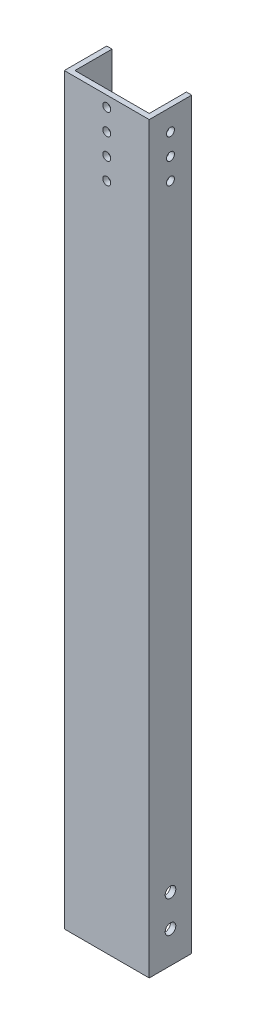
ISO-10303-21;
HEADER;
FILE_DESCRIPTION(('STEP AP214'),'2;1');
FILE_NAME('part.step','',(''),(''),'','','');
FILE_SCHEMA(('AUTOMOTIVE_DESIGN { 1 0 10303 214 1 1 1 1 }'));
ENDSEC;
DATA;
#1=APPLICATION_CONTEXT('core data for automotive mechanical design processes');
#2=APPLICATION_PROTOCOL_DEFINITION('international standard','automotive_design',2000,#1);
#3=PRODUCT_CONTEXT('',#1,'mechanical');
#4=PRODUCT('Part','Part','',(#3));
#5=PRODUCT_RELATED_PRODUCT_CATEGORY('part','',(#4));
#6=PRODUCT_DEFINITION_FORMATION('','',#4);
#7=PRODUCT_DEFINITION_CONTEXT('part definition',#1,'design');
#8=PRODUCT_DEFINITION('design','',#6,#7);
#9=PRODUCT_DEFINITION_SHAPE('','',#8);
#10=(LENGTH_UNIT() NAMED_UNIT(*) SI_UNIT(.MILLI.,.METRE.));
#11=(NAMED_UNIT(*) PLANE_ANGLE_UNIT() SI_UNIT($,.RADIAN.));
#12=(NAMED_UNIT(*) SI_UNIT($,.STERADIAN.) SOLID_ANGLE_UNIT());
#13=UNCERTAINTY_MEASURE_WITH_UNIT(LENGTH_MEASURE(1.E-05),#10,'distance_accuracy_value','');
#14=(GEOMETRIC_REPRESENTATION_CONTEXT(3) GLOBAL_UNCERTAINTY_ASSIGNED_CONTEXT((#13)) GLOBAL_UNIT_ASSIGNED_CONTEXT((#10,
#11,#12)) REPRESENTATION_CONTEXT('',''));
#15=CARTESIAN_POINT('',(0.,0.,0.));
#16=DIRECTION('',(0.,0.,1.));
#17=DIRECTION('',(1.,0.,0.));
#18=AXIS2_PLACEMENT_3D('',#15,#16,#17);
#19=CARTESIAN_POINT('',(0.,431.8,-12.7));
#20=DIRECTION('',(1.,0.,0.));
#21=DIRECTION('',(0.,0.,-1.));
#22=AXIS2_PLACEMENT_3D('',#19,#20,#21);
#23=CYLINDRICAL_SURFACE('',#22,2.38125000000006);
#24=CARTESIAN_POINT('',(0.,431.8,-12.7));
#25=DIRECTION('',(1.,0.,0.));
#26=DIRECTION('',(0.,0.,-1.));
#27=AXIS2_PLACEMENT_3D('',#24,#25,#26);
#28=CIRCLE('',#27,2.38125000000006);
#29=CARTESIAN_POINT('',(0.,431.8,-15.0812500000001));
#30=VERTEX_POINT('',#29);
#31=EDGE_CURVE('E167',#30,#30,#28,.F.);
#32=ORIENTED_EDGE('',*,*,#31,.T.);
#33=EDGE_LOOP('',(#32));
#34=FACE_BOUND('',#33,.T.);
#35=CARTESIAN_POINT('',(3.175,431.8,-12.7));
#36=DIRECTION('',(1.,0.,0.));
#37=DIRECTION('',(0.,0.,-1.));
#38=AXIS2_PLACEMENT_3D('',#35,#36,#37);
#39=CIRCLE('',#38,2.38125000000006);
#40=CARTESIAN_POINT('',(3.175,431.8,-15.0812500000001));
#41=VERTEX_POINT('',#40);
#42=EDGE_CURVE('E124',#41,#41,#39,.T.);
#43=ORIENTED_EDGE('',*,*,#42,.T.);
#44=EDGE_LOOP('',(#43));
#45=FACE_BOUND('',#44,.T.);
#46=ADVANCED_FACE('F17',(#34,#45),#23,.F.);
#47=CARTESIAN_POINT('',(0.,406.4,-12.7));
#48=DIRECTION('',(1.,0.,0.));
#49=DIRECTION('',(0.,0.,-1.));
#50=AXIS2_PLACEMENT_3D('',#47,#48,#49);
#51=CYLINDRICAL_SURFACE('',#50,2.38125000000006);
#52=CARTESIAN_POINT('',(0.,406.4,-12.7));
#53=DIRECTION('',(1.,0.,0.));
#54=DIRECTION('',(0.,0.,-1.));
#55=AXIS2_PLACEMENT_3D('',#52,#53,#54);
#56=CIRCLE('',#55,2.38125000000006);
#57=CARTESIAN_POINT('',(0.,406.4,-15.0812500000001));
#58=VERTEX_POINT('',#57);
#59=EDGE_CURVE('E164',#58,#58,#56,.F.);
#60=ORIENTED_EDGE('',*,*,#59,.T.);
#61=EDGE_LOOP('',(#60));
#62=FACE_BOUND('',#61,.T.);
#63=CARTESIAN_POINT('',(3.175,406.4,-12.7));
#64=DIRECTION('',(1.,0.,0.));
#65=DIRECTION('',(0.,0.,-1.));
#66=AXIS2_PLACEMENT_3D('',#63,#64,#65);
#67=CIRCLE('',#66,2.38125000000006);
#68=CARTESIAN_POINT('',(3.175,406.4,-15.0812500000001));
#69=VERTEX_POINT('',#68);
#70=EDGE_CURVE('E189',#69,#69,#67,.T.);
#71=ORIENTED_EDGE('',*,*,#70,.T.);
#72=EDGE_LOOP('',(#71));
#73=FACE_BOUND('',#72,.T.);
#74=ADVANCED_FACE('F284',(#62,#73),#51,.F.);
#75=CARTESIAN_POINT('',(0.,419.1,-12.7));
#76=DIRECTION('',(1.,0.,0.));
#77=DIRECTION('',(0.,0.,-1.));
#78=AXIS2_PLACEMENT_3D('',#75,#76,#77);
#79=CYLINDRICAL_SURFACE('',#78,2.38125000000006);
#80=CARTESIAN_POINT('',(0.,419.1,-12.7));
#81=DIRECTION('',(1.,0.,0.));
#82=DIRECTION('',(0.,0.,-1.));
#83=AXIS2_PLACEMENT_3D('',#80,#81,#82);
#84=CIRCLE('',#83,2.38125000000006);
#85=CARTESIAN_POINT('',(0.,419.1,-15.0812500000001));
#86=VERTEX_POINT('',#85);
#87=EDGE_CURVE('E161',#86,#86,#84,.F.);
#88=ORIENTED_EDGE('',*,*,#87,.T.);
#89=EDGE_LOOP('',(#88));
#90=FACE_BOUND('',#89,.T.);
#91=CARTESIAN_POINT('',(3.175,419.1,-12.7));
#92=DIRECTION('',(1.,0.,0.));
#93=DIRECTION('',(0.,0.,-1.));
#94=AXIS2_PLACEMENT_3D('',#91,#92,#93);
#95=CIRCLE('',#94,2.38125000000006);
#96=CARTESIAN_POINT('',(3.175,419.1,-15.0812500000001));
#97=VERTEX_POINT('',#96);
#98=EDGE_CURVE('E186',#97,#97,#95,.T.);
#99=ORIENTED_EDGE('',*,*,#98,.T.);
#100=EDGE_LOOP('',(#99));
#101=FACE_BOUND('',#100,.T.);
#102=ADVANCED_FACE('F289',(#90,#101),#79,.F.);
#103=CARTESIAN_POINT('',(0.,19.05,-12.7));
#104=DIRECTION('',(1.,0.,0.));
#105=DIRECTION('',(0.,0.,-1.));
#106=AXIS2_PLACEMENT_3D('',#103,#104,#105);
#107=CYLINDRICAL_SURFACE('',#106,3.17500000000001);
#108=CARTESIAN_POINT('',(0.,19.05,-12.7));
#109=DIRECTION('',(1.,0.,0.));
#110=DIRECTION('',(0.,0.,-1.));
#111=AXIS2_PLACEMENT_3D('',#108,#109,#110);
#112=CIRCLE('',#111,3.17500000000001);
#113=CARTESIAN_POINT('',(0.,19.05,-15.875));
#114=VERTEX_POINT('',#113);
#115=EDGE_CURVE('E158',#114,#114,#112,.F.);
#116=ORIENTED_EDGE('',*,*,#115,.T.);
#117=EDGE_LOOP('',(#116));
#118=FACE_BOUND('',#117,.T.);
#119=CARTESIAN_POINT('',(3.175,19.05,-12.7));
#120=DIRECTION('',(1.,0.,0.));
#121=DIRECTION('',(0.,0.,-1.));
#122=AXIS2_PLACEMENT_3D('',#119,#120,#121);
#123=CIRCLE('',#122,3.17500000000001);
#124=CARTESIAN_POINT('',(3.175,19.05,-15.875));
#125=VERTEX_POINT('',#124);
#126=EDGE_CURVE('E183',#125,#125,#123,.T.);
#127=ORIENTED_EDGE('',*,*,#126,.T.);
#128=EDGE_LOOP('',(#127));
#129=FACE_BOUND('',#128,.T.);
#130=ADVANCED_FACE('F296',(#118,#129),#107,.F.);
#131=CARTESIAN_POINT('',(0.,38.1,-12.7));
#132=DIRECTION('',(1.,0.,0.));
#133=DIRECTION('',(0.,0.,-1.));
#134=AXIS2_PLACEMENT_3D('',#131,#132,#133);
#135=CYLINDRICAL_SURFACE('',#134,3.175);
#136=CARTESIAN_POINT('',(0.,38.1,-12.7));
#137=DIRECTION('',(1.,0.,0.));
#138=DIRECTION('',(0.,0.,-1.));
#139=AXIS2_PLACEMENT_3D('',#136,#137,#138);
#140=CIRCLE('',#139,3.175);
#141=CARTESIAN_POINT('',(0.,38.1,-15.875));
#142=VERTEX_POINT('',#141);
#143=EDGE_CURVE('E95',#142,#142,#140,.F.);
#144=ORIENTED_EDGE('',*,*,#143,.T.);
#145=EDGE_LOOP('',(#144));
#146=FACE_BOUND('',#145,.T.);
#147=CARTESIAN_POINT('',(3.175,38.1,-12.7));
#148=DIRECTION('',(1.,0.,0.));
#149=DIRECTION('',(0.,0.,-1.));
#150=AXIS2_PLACEMENT_3D('',#147,#148,#149);
#151=CIRCLE('',#150,3.175);
#152=CARTESIAN_POINT('',(3.175,38.1,-15.875));
#153=VERTEX_POINT('',#152);
#154=EDGE_CURVE('E120',#153,#153,#151,.T.);
#155=ORIENTED_EDGE('',*,*,#154,.T.);
#156=EDGE_LOOP('',(#155));
#157=FACE_BOUND('',#156,.T.);
#158=ADVANCED_FACE('F303',(#146,#157),#135,.F.);
#159=CARTESIAN_POINT('',(0.,431.8,-12.7));
#160=DIRECTION('',(1.,0.,0.));
#161=DIRECTION('',(0.,0.,-1.));
#162=AXIS2_PLACEMENT_3D('',#159,#160,#161);
#163=CYLINDRICAL_SURFACE('',#162,2.38125000000006);
#164=CARTESIAN_POINT('',(47.625,431.8,-12.7));
#165=DIRECTION('',(1.,0.,0.));
#166=DIRECTION('',(0.,0.,-1.));
#167=AXIS2_PLACEMENT_3D('',#164,#165,#166);
#168=CIRCLE('',#167,2.38125000000006);
#169=CARTESIAN_POINT('',(47.625,431.8,-15.0812500000001));
#170=VERTEX_POINT('',#169);
#171=EDGE_CURVE('E20',#170,#170,#168,.F.);
#172=ORIENTED_EDGE('',*,*,#171,.T.);
#173=EDGE_LOOP('',(#172));
#174=FACE_BOUND('',#173,.T.);
#175=CARTESIAN_POINT('',(50.8,431.8,-12.7));
#176=DIRECTION('',(1.,0.,0.));
#177=DIRECTION('',(0.,0.,-1.));
#178=AXIS2_PLACEMENT_3D('',#175,#176,#177);
#179=CIRCLE('',#178,2.38125000000006);
#180=CARTESIAN_POINT('',(50.8,431.8,-15.0812500000001));
#181=VERTEX_POINT('',#180);
#182=EDGE_CURVE('E103',#181,#181,#179,.T.);
#183=ORIENTED_EDGE('',*,*,#182,.T.);
#184=EDGE_LOOP('',(#183));
#185=FACE_BOUND('',#184,.T.);
#186=ADVANCED_FACE('F208',(#174,#185),#163,.F.);
#187=CARTESIAN_POINT('',(0.,406.4,-12.7));
#188=DIRECTION('',(1.,0.,0.));
#189=DIRECTION('',(0.,0.,-1.));
#190=AXIS2_PLACEMENT_3D('',#187,#188,#189);
#191=CYLINDRICAL_SURFACE('',#190,2.38125000000006);
#192=CARTESIAN_POINT('',(47.625,406.4,-12.7));
#193=DIRECTION('',(1.,0.,0.));
#194=DIRECTION('',(0.,0.,-1.));
#195=AXIS2_PLACEMENT_3D('',#192,#193,#194);
#196=CIRCLE('',#195,2.38125000000006);
#197=CARTESIAN_POINT('',(47.625,406.4,-15.0812500000001));
#198=VERTEX_POINT('',#197);
#199=EDGE_CURVE('E201',#198,#198,#196,.F.);
#200=ORIENTED_EDGE('',*,*,#199,.T.);
#201=EDGE_LOOP('',(#200));
#202=FACE_BOUND('',#201,.T.);
#203=CARTESIAN_POINT('',(50.8,406.4,-12.7));
#204=DIRECTION('',(1.,0.,0.));
#205=DIRECTION('',(0.,0.,-1.));
#206=AXIS2_PLACEMENT_3D('',#203,#204,#205);
#207=CIRCLE('',#206,2.38125000000006);
#208=CARTESIAN_POINT('',(50.8,406.4,-15.0812500000001));
#209=VERTEX_POINT('',#208);
#210=EDGE_CURVE('E151',#209,#209,#207,.T.);
#211=ORIENTED_EDGE('',*,*,#210,.T.);
#212=EDGE_LOOP('',(#211));
#213=FACE_BOUND('',#212,.T.);
#214=ADVANCED_FACE('F310',(#202,#213),#191,.F.);
#215=CARTESIAN_POINT('',(0.,419.1,-12.7));
#216=DIRECTION('',(1.,0.,0.));
#217=DIRECTION('',(0.,0.,-1.));
#218=AXIS2_PLACEMENT_3D('',#215,#216,#217);
#219=CYLINDRICAL_SURFACE('',#218,2.38125000000006);
#220=CARTESIAN_POINT('',(47.625,419.1,-12.7));
#221=DIRECTION('',(1.,0.,0.));
#222=DIRECTION('',(0.,0.,-1.));
#223=AXIS2_PLACEMENT_3D('',#220,#221,#222);
#224=CIRCLE('',#223,2.38125000000006);
#225=CARTESIAN_POINT('',(47.625,419.1,-15.0812500000001));
#226=VERTEX_POINT('',#225);
#227=EDGE_CURVE('E199',#226,#226,#224,.F.);
#228=ORIENTED_EDGE('',*,*,#227,.T.);
#229=EDGE_LOOP('',(#228));
#230=FACE_BOUND('',#229,.T.);
#231=CARTESIAN_POINT('',(50.8,419.1,-12.7));
#232=DIRECTION('',(1.,0.,0.));
#233=DIRECTION('',(0.,0.,-1.));
#234=AXIS2_PLACEMENT_3D('',#231,#232,#233);
#235=CIRCLE('',#234,2.38125000000006);
#236=CARTESIAN_POINT('',(50.8,419.1,-15.0812500000001));
#237=VERTEX_POINT('',#236);
#238=EDGE_CURVE('E148',#237,#237,#235,.T.);
#239=ORIENTED_EDGE('',*,*,#238,.T.);
#240=EDGE_LOOP('',(#239));
#241=FACE_BOUND('',#240,.T.);
#242=ADVANCED_FACE('F313',(#230,#241),#219,.F.);
#243=CARTESIAN_POINT('',(0.,19.05,-12.7));
#244=DIRECTION('',(1.,0.,0.));
#245=DIRECTION('',(0.,0.,-1.));
#246=AXIS2_PLACEMENT_3D('',#243,#244,#245);
#247=CYLINDRICAL_SURFACE('',#246,3.17500000000001);
#248=CARTESIAN_POINT('',(47.625,19.05,-12.7));
#249=DIRECTION('',(1.,0.,0.));
#250=DIRECTION('',(0.,0.,-1.));
#251=AXIS2_PLACEMENT_3D('',#248,#249,#250);
#252=CIRCLE('',#251,3.17500000000001);
#253=CARTESIAN_POINT('',(47.625,19.05,-15.875));
#254=VERTEX_POINT('',#253);
#255=EDGE_CURVE('E196',#254,#254,#252,.F.);
#256=ORIENTED_EDGE('',*,*,#255,.T.);
#257=EDGE_LOOP('',(#256));
#258=FACE_BOUND('',#257,.T.);
#259=CARTESIAN_POINT('',(50.8,19.05,-12.7));
#260=DIRECTION('',(1.,0.,0.));
#261=DIRECTION('',(0.,0.,-1.));
#262=AXIS2_PLACEMENT_3D('',#259,#260,#261);
#263=CIRCLE('',#262,3.17500000000001);
#264=CARTESIAN_POINT('',(50.8,19.05,-15.875));
#265=VERTEX_POINT('',#264);
#266=EDGE_CURVE('E145',#265,#265,#263,.T.);
#267=ORIENTED_EDGE('',*,*,#266,.T.);
#268=EDGE_LOOP('',(#267));
#269=FACE_BOUND('',#268,.T.);
#270=ADVANCED_FACE('F316',(#258,#269),#247,.F.);
#271=CARTESIAN_POINT('',(0.,38.1,-12.7));
#272=DIRECTION('',(1.,0.,0.));
#273=DIRECTION('',(0.,0.,-1.));
#274=AXIS2_PLACEMENT_3D('',#271,#272,#273);
#275=CYLINDRICAL_SURFACE('',#274,3.175);
#276=CARTESIAN_POINT('',(47.625,38.1,-12.7));
#277=DIRECTION('',(1.,0.,0.));
#278=DIRECTION('',(0.,0.,-1.));
#279=AXIS2_PLACEMENT_3D('',#276,#277,#278);
#280=CIRCLE('',#279,3.175);
#281=CARTESIAN_POINT('',(47.625,38.1,-15.875));
#282=VERTEX_POINT('',#281);
#283=EDGE_CURVE('E127',#282,#282,#280,.F.);
#284=ORIENTED_EDGE('',*,*,#283,.T.);
#285=EDGE_LOOP('',(#284));
#286=FACE_BOUND('',#285,.T.);
#287=CARTESIAN_POINT('',(50.8,38.1,-12.7));
#288=DIRECTION('',(1.,0.,0.));
#289=DIRECTION('',(0.,0.,-1.));
#290=AXIS2_PLACEMENT_3D('',#287,#288,#289);
#291=CIRCLE('',#290,3.175);
#292=CARTESIAN_POINT('',(50.8,38.1,-15.875));
#293=VERTEX_POINT('',#292);
#294=EDGE_CURVE('E141',#293,#293,#291,.T.);
#295=ORIENTED_EDGE('',*,*,#294,.T.);
#296=EDGE_LOOP('',(#295));
#297=FACE_BOUND('',#296,.T.);
#298=ADVANCED_FACE('F225',(#286,#297),#275,.F.);
#299=CARTESIAN_POINT('',(50.8,444.5,-25.4));
#300=DIRECTION('',(0.,0.,1.));
#301=DIRECTION('',(1.,0.,0.));
#302=AXIS2_PLACEMENT_3D('',#299,#300,#301);
#303=PLANE('',#302);
#304=DIRECTION('',(0.,1.,0.));
#305=VECTOR('',#304,1.);
#306=CARTESIAN_POINT('',(47.625,444.5,-25.4));
#307=LINE('',#306,#305);
#308=CARTESIAN_POINT('',(47.625,0.,-25.4));
#309=VERTEX_POINT('',#308);
#310=CARTESIAN_POINT('',(47.625,444.5,-25.4));
#311=VERTEX_POINT('',#310);
#312=EDGE_CURVE('E125',#309,#311,#307,.T.);
#313=ORIENTED_EDGE('',*,*,#312,.T.);
#314=DIRECTION('',(1.,0.,0.));
#315=VECTOR('',#314,1.);
#316=CARTESIAN_POINT('',(0.,444.5,-25.4));
#317=LINE('',#316,#315);
#318=CARTESIAN_POINT('',(50.8,444.5,-25.4));
#319=VERTEX_POINT('',#318);
#320=EDGE_CURVE('E78',#319,#311,#317,.F.);
#321=ORIENTED_EDGE('',*,*,#320,.F.);
#322=DIRECTION('',(0.,1.,0.));
#323=VECTOR('',#322,1.);
#324=CARTESIAN_POINT('',(50.8,444.5,-25.4));
#325=LINE('',#324,#323);
#326=CARTESIAN_POINT('',(50.8,0.,-25.4));
#327=VERTEX_POINT('',#326);
#328=EDGE_CURVE('E512',#319,#327,#325,.F.);
#329=ORIENTED_EDGE('',*,*,#328,.T.);
#330=DIRECTION('',(1.,0.,0.));
#331=VECTOR('',#330,1.);
#332=CARTESIAN_POINT('',(0.,0.,-25.4));
#333=LINE('',#332,#331);
#334=EDGE_CURVE('E508',#327,#309,#333,.F.);
#335=ORIENTED_EDGE('',*,*,#334,.T.);
#336=EDGE_LOOP('',(#313,#321,#329,#335));
#337=FACE_BOUND('',#336,.T.);
#338=ADVANCED_FACE('F214',(#337),#303,.F.);
#339=CARTESIAN_POINT('',(47.625,444.5,-25.4));
#340=DIRECTION('',(1.,0.,0.));
#341=DIRECTION('',(0.,0.,-1.));
#342=AXIS2_PLACEMENT_3D('',#339,#340,#341);
#343=PLANE('',#342);
#344=DIRECTION('',(0.,1.,0.));
#345=VECTOR('',#344,1.);
#346=CARTESIAN_POINT('',(47.625,444.5,-3.175));
#347=LINE('',#346,#345);
#348=CARTESIAN_POINT('',(47.625,0.,-3.175));
#349=VERTEX_POINT('',#348);
#350=CARTESIAN_POINT('',(47.625,444.5,-3.175));
#351=VERTEX_POINT('',#350);
#352=EDGE_CURVE('E121',#349,#351,#347,.T.);
#353=ORIENTED_EDGE('',*,*,#352,.T.);
#354=DIRECTION('',(0.,0.,1.));
#355=VECTOR('',#354,1.);
#356=CARTESIAN_POINT('',(47.625,444.5,0.));
#357=LINE('',#356,#355);
#358=EDGE_CURVE('E110',#311,#351,#357,.T.);
#359=ORIENTED_EDGE('',*,*,#358,.F.);
#360=ORIENTED_EDGE('',*,*,#312,.F.);
#361=DIRECTION('',(0.,0.,1.));
#362=VECTOR('',#361,1.);
#363=CARTESIAN_POINT('',(47.625,0.,0.));
#364=LINE('',#363,#362);
#365=EDGE_CURVE('E505',#309,#349,#364,.T.);
#366=ORIENTED_EDGE('',*,*,#365,.T.);
#367=EDGE_LOOP('',(#353,#359,#360,#366));
#368=FACE_BOUND('',#367,.T.);
#369=ORIENTED_EDGE('',*,*,#283,.F.);
#370=EDGE_LOOP('',(#369));
#371=FACE_BOUND('',#370,.T.);
#372=ORIENTED_EDGE('',*,*,#255,.F.);
#373=EDGE_LOOP('',(#372));
#374=FACE_BOUND('',#373,.T.);
#375=ORIENTED_EDGE('',*,*,#227,.F.);
#376=EDGE_LOOP('',(#375));
#377=FACE_BOUND('',#376,.T.);
#378=ORIENTED_EDGE('',*,*,#199,.F.);
#379=EDGE_LOOP('',(#378));
#380=FACE_BOUND('',#379,.T.);
#381=ORIENTED_EDGE('',*,*,#171,.F.);
#382=EDGE_LOOP('',(#381));
#383=FACE_BOUND('',#382,.T.);
#384=ADVANCED_FACE('F211',(#368,#371,#374,#377,#380,#383),#343,.F.);
#385=CARTESIAN_POINT('',(47.625,444.5,-3.175));
#386=DIRECTION('',(0.,0.,1.));
#387=DIRECTION('',(1.,0.,0.));
#388=AXIS2_PLACEMENT_3D('',#385,#386,#387);
#389=PLANE('',#388);
#390=DIRECTION('',(0.,1.,0.));
#391=VECTOR('',#390,1.);
#392=CARTESIAN_POINT('',(3.175,444.5,-3.17499999999999));
#393=LINE('',#392,#391);
#394=CARTESIAN_POINT('',(3.175,0.,-3.175));
#395=VERTEX_POINT('',#394);
#396=CARTESIAN_POINT('',(3.175,444.5,-3.175));
#397=VERTEX_POINT('',#396);
#398=EDGE_CURVE('E117',#395,#397,#393,.T.);
#399=ORIENTED_EDGE('',*,*,#398,.T.);
#400=DIRECTION('',(1.,0.,0.));
#401=VECTOR('',#400,1.);
#402=CARTESIAN_POINT('',(0.,444.5,-3.175));
#403=LINE('',#402,#401);
#404=EDGE_CURVE('E516',#351,#397,#403,.F.);
#405=ORIENTED_EDGE('',*,*,#404,.F.);
#406=ORIENTED_EDGE('',*,*,#352,.F.);
#407=DIRECTION('',(1.,0.,0.));
#408=VECTOR('',#407,1.);
#409=CARTESIAN_POINT('',(0.,0.,-3.175));
#410=LINE('',#409,#408);
#411=EDGE_CURVE('E500',#349,#395,#410,.F.);
#412=ORIENTED_EDGE('',*,*,#411,.T.);
#413=EDGE_LOOP('',(#399,#405,#406,#412));
#414=FACE_BOUND('',#413,.T.);
#415=CARTESIAN_POINT('',(25.4,438.15,-3.175));
#416=DIRECTION('',(0.,0.,1.));
#417=DIRECTION('',(1.,0.,0.));
#418=AXIS2_PLACEMENT_3D('',#415,#416,#417);
#419=CIRCLE('',#418,2.38125000000002);
#420=CARTESIAN_POINT('',(27.78125,438.15,-3.175));
#421=VERTEX_POINT('',#420);
#422=EDGE_CURVE('E170',#421,#421,#419,.T.);
#423=ORIENTED_EDGE('',*,*,#422,.T.);
#424=EDGE_LOOP('',(#423));
#425=FACE_BOUND('',#424,.T.);
#426=CARTESIAN_POINT('',(25.4,400.05,-3.175));
#427=DIRECTION('',(0.,0.,1.));
#428=DIRECTION('',(1.,0.,0.));
#429=AXIS2_PLACEMENT_3D('',#426,#427,#428);
#430=CIRCLE('',#429,2.38125000000002);
#431=CARTESIAN_POINT('',(27.78125,400.05,-3.175));
#432=VERTEX_POINT('',#431);
#433=EDGE_CURVE('E173',#432,#432,#430,.T.);
#434=ORIENTED_EDGE('',*,*,#433,.T.);
#435=EDGE_LOOP('',(#434));
#436=FACE_BOUND('',#435,.T.);
#437=CARTESIAN_POINT('',(25.4,412.75,-3.175));
#438=DIRECTION('',(0.,0.,1.));
#439=DIRECTION('',(1.,0.,0.));
#440=AXIS2_PLACEMENT_3D('',#437,#438,#439);
#441=CIRCLE('',#440,2.38125000000002);
#442=CARTESIAN_POINT('',(27.78125,412.75,-3.175));
#443=VERTEX_POINT('',#442);
#444=EDGE_CURVE('E176',#443,#443,#441,.T.);
#445=ORIENTED_EDGE('',*,*,#444,.T.);
#446=EDGE_LOOP('',(#445));
#447=FACE_BOUND('',#446,.T.);
#448=CARTESIAN_POINT('',(25.4,425.45,-3.175));
#449=DIRECTION('',(0.,0.,1.));
#450=DIRECTION('',(1.,0.,0.));
#451=AXIS2_PLACEMENT_3D('',#448,#449,#450);
#452=CIRCLE('',#451,2.38125000000002);
#453=CARTESIAN_POINT('',(27.78125,425.45,-3.175));
#454=VERTEX_POINT('',#453);
#455=EDGE_CURVE('E116',#454,#454,#452,.T.);
#456=ORIENTED_EDGE('',*,*,#455,.T.);
#457=EDGE_LOOP('',(#456));
#458=FACE_BOUND('',#457,.T.);
#459=ADVANCED_FACE('F213',(#414,#425,#436,#447,#458),#389,.F.);
#460=CARTESIAN_POINT('',(3.175,444.5,-3.17499999999999));
#461=DIRECTION('',(-1.,0.,0.));
#462=DIRECTION('',(0.,0.,1.));
#463=AXIS2_PLACEMENT_3D('',#460,#461,#462);
#464=PLANE('',#463);
#465=DIRECTION('',(0.,1.,0.));
#466=VECTOR('',#465,1.);
#467=CARTESIAN_POINT('',(3.175,444.5,-25.4));
#468=LINE('',#467,#466);
#469=CARTESIAN_POINT('',(3.175,0.,-25.4));
#470=VERTEX_POINT('',#469);
#471=CARTESIAN_POINT('',(3.175,444.5,-25.4));
#472=VERTEX_POINT('',#471);
#473=EDGE_CURVE('E114',#470,#472,#468,.T.);
#474=ORIENTED_EDGE('',*,*,#473,.T.);
#475=DIRECTION('',(0.,0.,1.));
#476=VECTOR('',#475,1.);
#477=CARTESIAN_POINT('',(3.175,444.5,0.));
#478=LINE('',#477,#476);
#479=EDGE_CURVE('E101',#397,#472,#478,.F.);
#480=ORIENTED_EDGE('',*,*,#479,.F.);
#481=ORIENTED_EDGE('',*,*,#398,.F.);
#482=DIRECTION('',(0.,0.,1.));
#483=VECTOR('',#482,1.);
#484=CARTESIAN_POINT('',(3.175,0.,0.));
#485=LINE('',#484,#483);
#486=EDGE_CURVE('E495',#395,#470,#485,.F.);
#487=ORIENTED_EDGE('',*,*,#486,.T.);
#488=EDGE_LOOP('',(#474,#480,#481,#487));
#489=FACE_BOUND('',#488,.T.);
#490=ORIENTED_EDGE('',*,*,#154,.F.);
#491=EDGE_LOOP('',(#490));
#492=FACE_BOUND('',#491,.T.);
#493=ORIENTED_EDGE('',*,*,#126,.F.);
#494=EDGE_LOOP('',(#493));
#495=FACE_BOUND('',#494,.T.);
#496=ORIENTED_EDGE('',*,*,#98,.F.);
#497=EDGE_LOOP('',(#496));
#498=FACE_BOUND('',#497,.T.);
#499=ORIENTED_EDGE('',*,*,#70,.F.);
#500=EDGE_LOOP('',(#499));
#501=FACE_BOUND('',#500,.T.);
#502=ORIENTED_EDGE('',*,*,#42,.F.);
#503=EDGE_LOOP('',(#502));
#504=FACE_BOUND('',#503,.T.);
#505=ADVANCED_FACE('F222',(#489,#492,#495,#498,#501,#504),#464,.F.);
#506=CARTESIAN_POINT('',(3.175,444.5,-25.4));
#507=DIRECTION('',(0.,0.,1.));
#508=DIRECTION('',(1.,0.,0.));
#509=AXIS2_PLACEMENT_3D('',#506,#507,#508);
#510=PLANE('',#509);
#511=DIRECTION('',(0.,1.,0.));
#512=VECTOR('',#511,1.);
#513=CARTESIAN_POINT('',(0.,444.5,-25.4));
#514=LINE('',#513,#512);
#515=CARTESIAN_POINT('',(0.,0.,-25.4));
#516=VERTEX_POINT('',#515);
#517=CARTESIAN_POINT('',(0.,444.5,-25.4));
#518=VERTEX_POINT('',#517);
#519=EDGE_CURVE('E84',#516,#518,#514,.T.);
#520=ORIENTED_EDGE('',*,*,#519,.T.);
#521=DIRECTION('',(1.,0.,0.));
#522=VECTOR('',#521,1.);
#523=CARTESIAN_POINT('',(0.,444.5,-25.4));
#524=LINE('',#523,#522);
#525=EDGE_CURVE('E87',#472,#518,#524,.F.);
#526=ORIENTED_EDGE('',*,*,#525,.F.);
#527=ORIENTED_EDGE('',*,*,#473,.F.);
#528=DIRECTION('',(1.,0.,0.));
#529=VECTOR('',#528,1.);
#530=CARTESIAN_POINT('',(0.,0.,-25.4));
#531=LINE('',#530,#529);
#532=EDGE_CURVE('E89',#470,#516,#531,.F.);
#533=ORIENTED_EDGE('',*,*,#532,.T.);
#534=EDGE_LOOP('',(#520,#526,#527,#533));
#535=FACE_BOUND('',#534,.T.);
#536=ADVANCED_FACE('F86',(#535),#510,.F.);
#537=CARTESIAN_POINT('',(25.4,425.45,-25.4));
#538=DIRECTION('',(0.,0.,1.));
#539=DIRECTION('',(1.,0.,0.));
#540=AXIS2_PLACEMENT_3D('',#537,#538,#539);
#541=CYLINDRICAL_SURFACE('',#540,2.38125000000002);
#542=ORIENTED_EDGE('',*,*,#455,.F.);
#543=EDGE_LOOP('',(#542));
#544=FACE_BOUND('',#543,.T.);
#545=CARTESIAN_POINT('',(25.4,425.45,0.));
#546=DIRECTION('',(0.,0.,1.));
#547=DIRECTION('',(1.,0.,0.));
#548=AXIS2_PLACEMENT_3D('',#545,#546,#547);
#549=CIRCLE('',#548,2.38125000000002);
#550=CARTESIAN_POINT('',(27.78125,425.45,0.));
#551=VERTEX_POINT('',#550);
#552=EDGE_CURVE('E137',#551,#551,#549,.T.);
#553=ORIENTED_EDGE('',*,*,#552,.T.);
#554=EDGE_LOOP('',(#553));
#555=FACE_BOUND('',#554,.T.);
#556=ADVANCED_FACE('F260',(#544,#555),#541,.F.);
#557=CARTESIAN_POINT('',(25.4,412.75,-25.4));
#558=DIRECTION('',(0.,0.,1.));
#559=DIRECTION('',(1.,0.,0.));
#560=AXIS2_PLACEMENT_3D('',#557,#558,#559);
#561=CYLINDRICAL_SURFACE('',#560,2.38125000000002);
#562=ORIENTED_EDGE('',*,*,#444,.F.);
#563=EDGE_LOOP('',(#562));
#564=FACE_BOUND('',#563,.T.);
#565=CARTESIAN_POINT('',(25.4,412.75,0.));
#566=DIRECTION('',(0.,0.,1.));
#567=DIRECTION('',(1.,0.,0.));
#568=AXIS2_PLACEMENT_3D('',#565,#566,#567);
#569=CIRCLE('',#568,2.38125000000002);
#570=CARTESIAN_POINT('',(27.78125,412.75,0.));
#571=VERTEX_POINT('',#570);
#572=EDGE_CURVE('E134',#571,#571,#569,.T.);
#573=ORIENTED_EDGE('',*,*,#572,.T.);
#574=EDGE_LOOP('',(#573));
#575=FACE_BOUND('',#574,.T.);
#576=ADVANCED_FACE('F256',(#564,#575),#561,.F.);
#577=CARTESIAN_POINT('',(25.4,400.05,-25.4));
#578=DIRECTION('',(0.,0.,1.));
#579=DIRECTION('',(1.,0.,0.));
#580=AXIS2_PLACEMENT_3D('',#577,#578,#579);
#581=CYLINDRICAL_SURFACE('',#580,2.38125000000002);
#582=ORIENTED_EDGE('',*,*,#433,.F.);
#583=EDGE_LOOP('',(#582));
#584=FACE_BOUND('',#583,.T.);
#585=CARTESIAN_POINT('',(25.4,400.05,0.));
#586=DIRECTION('',(0.,0.,1.));
#587=DIRECTION('',(1.,0.,0.));
#588=AXIS2_PLACEMENT_3D('',#585,#586,#587);
#589=CIRCLE('',#588,2.38125000000002);
#590=CARTESIAN_POINT('',(27.78125,400.05,0.));
#591=VERTEX_POINT('',#590);
#592=EDGE_CURVE('E131',#591,#591,#589,.T.);
#593=ORIENTED_EDGE('',*,*,#592,.T.);
#594=EDGE_LOOP('',(#593));
#595=FACE_BOUND('',#594,.T.);
#596=ADVANCED_FACE('F252',(#584,#595),#581,.F.);
#597=CARTESIAN_POINT('',(25.4,438.15,-25.4));
#598=DIRECTION('',(0.,0.,1.));
#599=DIRECTION('',(1.,0.,0.));
#600=AXIS2_PLACEMENT_3D('',#597,#598,#599);
#601=CYLINDRICAL_SURFACE('',#600,2.38125000000002);
#602=ORIENTED_EDGE('',*,*,#422,.F.);
#603=EDGE_LOOP('',(#602));
#604=FACE_BOUND('',#603,.T.);
#605=CARTESIAN_POINT('',(25.4,438.15,0.));
#606=DIRECTION('',(0.,0.,1.));
#607=DIRECTION('',(1.,0.,0.));
#608=AXIS2_PLACEMENT_3D('',#605,#606,#607);
#609=CIRCLE('',#608,2.38125000000002);
#610=CARTESIAN_POINT('',(27.78125,438.15,0.));
#611=VERTEX_POINT('',#610);
#612=EDGE_CURVE('E128',#611,#611,#609,.T.);
#613=ORIENTED_EDGE('',*,*,#612,.T.);
#614=EDGE_LOOP('',(#613));
#615=FACE_BOUND('',#614,.T.);
#616=ADVANCED_FACE('F249',(#604,#615),#601,.F.);
#617=CARTESIAN_POINT('',(0.,444.5,-25.4));
#618=DIRECTION('',(1.,0.,0.));
#619=DIRECTION('',(0.,0.,-1.));
#620=AXIS2_PLACEMENT_3D('',#617,#618,#619);
#621=PLANE('',#620);
#622=DIRECTION('',(0.,1.,0.));
#623=VECTOR('',#622,1.);
#624=CARTESIAN_POINT('',(0.,444.5,0.));
#625=LINE('',#624,#623);
#626=CARTESIAN_POINT('',(0.,0.,0.));
#627=VERTEX_POINT('',#626);
#628=CARTESIAN_POINT('',(0.,444.5,0.));
#629=VERTEX_POINT('',#628);
#630=EDGE_CURVE('E108',#627,#629,#625,.T.);
#631=ORIENTED_EDGE('',*,*,#630,.T.);
#632=DIRECTION('',(0.,0.,1.));
#633=VECTOR('',#632,1.);
#634=CARTESIAN_POINT('',(0.,444.5,0.));
#635=LINE('',#634,#633);
#636=EDGE_CURVE('E94',#518,#629,#635,.T.);
#637=ORIENTED_EDGE('',*,*,#636,.F.);
#638=ORIENTED_EDGE('',*,*,#519,.F.);
#639=DIRECTION('',(0.,0.,1.));
#640=VECTOR('',#639,1.);
#641=CARTESIAN_POINT('',(0.,0.,0.));
#642=LINE('',#641,#640);
#643=EDGE_CURVE('E140',#516,#627,#642,.T.);
#644=ORIENTED_EDGE('',*,*,#643,.T.);
#645=EDGE_LOOP('',(#631,#637,#638,#644));
#646=FACE_BOUND('',#645,.T.);
#647=ORIENTED_EDGE('',*,*,#143,.F.);
#648=EDGE_LOOP('',(#647));
#649=FACE_BOUND('',#648,.T.);
#650=ORIENTED_EDGE('',*,*,#115,.F.);
#651=EDGE_LOOP('',(#650));
#652=FACE_BOUND('',#651,.T.);
#653=ORIENTED_EDGE('',*,*,#87,.F.);
#654=EDGE_LOOP('',(#653));
#655=FACE_BOUND('',#654,.T.);
#656=ORIENTED_EDGE('',*,*,#59,.F.);
#657=EDGE_LOOP('',(#656));
#658=FACE_BOUND('',#657,.T.);
#659=ORIENTED_EDGE('',*,*,#31,.F.);
#660=EDGE_LOOP('',(#659));
#661=FACE_BOUND('',#660,.T.);
#662=ADVANCED_FACE('F106',(#646,#649,#652,#655,#658,#661),#621,.F.);
#663=CARTESIAN_POINT('',(0.,444.5,0.));
#664=DIRECTION('',(0.,1.,0.));
#665=DIRECTION('',(0.,0.,1.));
#666=AXIS2_PLACEMENT_3D('',#663,#664,#665);
#667=PLANE('',#666);
#668=ORIENTED_EDGE('',*,*,#479,.T.);
#669=ORIENTED_EDGE('',*,*,#525,.T.);
#670=ORIENTED_EDGE('',*,*,#636,.T.);
#671=DIRECTION('',(-1.,0.,0.));
#672=VECTOR('',#671,1.);
#673=CARTESIAN_POINT('',(0.,444.5,0.));
#674=LINE('',#673,#672);
#675=CARTESIAN_POINT('',(50.8,444.5,0.));
#676=VERTEX_POINT('',#675);
#677=EDGE_CURVE('E523',#629,#676,#674,.F.);
#678=ORIENTED_EDGE('',*,*,#677,.T.);
#679=DIRECTION('',(0.,0.,1.));
#680=VECTOR('',#679,1.);
#681=CARTESIAN_POINT('',(50.8,444.5,0.));
#682=LINE('',#681,#680);
#683=EDGE_CURVE('E144',#676,#319,#682,.F.);
#684=ORIENTED_EDGE('',*,*,#683,.T.);
#685=ORIENTED_EDGE('',*,*,#320,.T.);
#686=ORIENTED_EDGE('',*,*,#358,.T.);
#687=ORIENTED_EDGE('',*,*,#404,.T.);
#688=EDGE_LOOP('',(#668,#669,#670,#678,#684,#685,#686,#687));
#689=FACE_BOUND('',#688,.T.);
#690=ADVANCED_FACE('F97',(#689),#667,.T.);
#691=CARTESIAN_POINT('',(50.8,444.5,0.));
#692=DIRECTION('',(-1.,0.,0.));
#693=DIRECTION('',(0.,0.,1.));
#694=AXIS2_PLACEMENT_3D('',#691,#692,#693);
#695=PLANE('',#694);
#696=ORIENTED_EDGE('',*,*,#328,.F.);
#697=ORIENTED_EDGE('',*,*,#683,.F.);
#698=DIRECTION('',(0.,1.,0.));
#699=VECTOR('',#698,1.);
#700=CARTESIAN_POINT('',(50.8,444.5,0.));
#701=LINE('',#700,#699);
#702=CARTESIAN_POINT('',(50.8,0.,0.));
#703=VERTEX_POINT('',#702);
#704=EDGE_CURVE('E26',#676,#703,#701,.F.);
#705=ORIENTED_EDGE('',*,*,#704,.T.);
#706=DIRECTION('',(0.,0.,1.));
#707=VECTOR('',#706,1.);
#708=CARTESIAN_POINT('',(50.8,0.,0.));
#709=LINE('',#708,#707);
#710=EDGE_CURVE('E34',#703,#327,#709,.F.);
#711=ORIENTED_EDGE('',*,*,#710,.T.);
#712=EDGE_LOOP('',(#696,#697,#705,#711));
#713=FACE_BOUND('',#712,.T.);
#714=ORIENTED_EDGE('',*,*,#294,.F.);
#715=EDGE_LOOP('',(#714));
#716=FACE_BOUND('',#715,.T.);
#717=ORIENTED_EDGE('',*,*,#266,.F.);
#718=EDGE_LOOP('',(#717));
#719=FACE_BOUND('',#718,.T.);
#720=ORIENTED_EDGE('',*,*,#238,.F.);
#721=EDGE_LOOP('',(#720));
#722=FACE_BOUND('',#721,.T.);
#723=ORIENTED_EDGE('',*,*,#210,.F.);
#724=EDGE_LOOP('',(#723));
#725=FACE_BOUND('',#724,.T.);
#726=ORIENTED_EDGE('',*,*,#182,.F.);
#727=EDGE_LOOP('',(#726));
#728=FACE_BOUND('',#727,.T.);
#729=ADVANCED_FACE('F237',(#713,#716,#719,#722,#725,#728),#695,.F.);
#730=CARTESIAN_POINT('',(0.,0.,0.));
#731=DIRECTION('',(0.,1.,0.));
#732=DIRECTION('',(0.,0.,1.));
#733=AXIS2_PLACEMENT_3D('',#730,#731,#732);
#734=PLANE('',#733);
#735=ORIENTED_EDGE('',*,*,#532,.F.);
#736=ORIENTED_EDGE('',*,*,#486,.F.);
#737=ORIENTED_EDGE('',*,*,#411,.F.);
#738=ORIENTED_EDGE('',*,*,#365,.F.);
#739=ORIENTED_EDGE('',*,*,#334,.F.);
#740=ORIENTED_EDGE('',*,*,#710,.F.);
#741=DIRECTION('',(-1.,0.,0.));
#742=VECTOR('',#741,1.);
#743=CARTESIAN_POINT('',(0.,0.,0.));
#744=LINE('',#743,#742);
#745=EDGE_CURVE('E11',#703,#627,#744,.T.);
#746=ORIENTED_EDGE('',*,*,#745,.T.);
#747=ORIENTED_EDGE('',*,*,#643,.F.);
#748=EDGE_LOOP('',(#735,#736,#737,#738,#739,#740,#746,#747));
#749=FACE_BOUND('',#748,.T.);
#750=ADVANCED_FACE('F231',(#749),#734,.F.);
#751=CARTESIAN_POINT('',(0.,444.5,0.));
#752=DIRECTION('',(0.,0.,-1.));
#753=DIRECTION('',(-1.,0.,0.));
#754=AXIS2_PLACEMENT_3D('',#751,#752,#753);
#755=PLANE('',#754);
#756=ORIENTED_EDGE('',*,*,#704,.F.);
#757=ORIENTED_EDGE('',*,*,#677,.F.);
#758=ORIENTED_EDGE('',*,*,#630,.F.);
#759=ORIENTED_EDGE('',*,*,#745,.F.);
#760=EDGE_LOOP('',(#756,#757,#758,#759));
#761=FACE_BOUND('',#760,.T.);
#762=ORIENTED_EDGE('',*,*,#612,.F.);
#763=EDGE_LOOP('',(#762));
#764=FACE_BOUND('',#763,.T.);
#765=ORIENTED_EDGE('',*,*,#592,.F.);
#766=EDGE_LOOP('',(#765));
#767=FACE_BOUND('',#766,.T.);
#768=ORIENTED_EDGE('',*,*,#572,.F.);
#769=EDGE_LOOP('',(#768));
#770=FACE_BOUND('',#769,.T.);
#771=ORIENTED_EDGE('',*,*,#552,.F.);
#772=EDGE_LOOP('',(#771));
#773=FACE_BOUND('',#772,.T.);
#774=ADVANCED_FACE('F229',(#761,#764,#767,#770,#773),#755,.F.);
#775=CLOSED_SHELL('',(#46,#74,#102,#130,#158,#186,#214,#242,#270,#298,#338,#384,#459,#505,#536,
#556,#576,#596,#616,#662,#690,#729,#750,#774));
#776=MANIFOLD_SOLID_BREP('B1',#775);
#777=ADVANCED_BREP_SHAPE_REPRESENTATION('',(#18,#776),#14);
#778=SHAPE_DEFINITION_REPRESENTATION(#9,#777);
ENDSEC;
END-ISO-10303-21;
